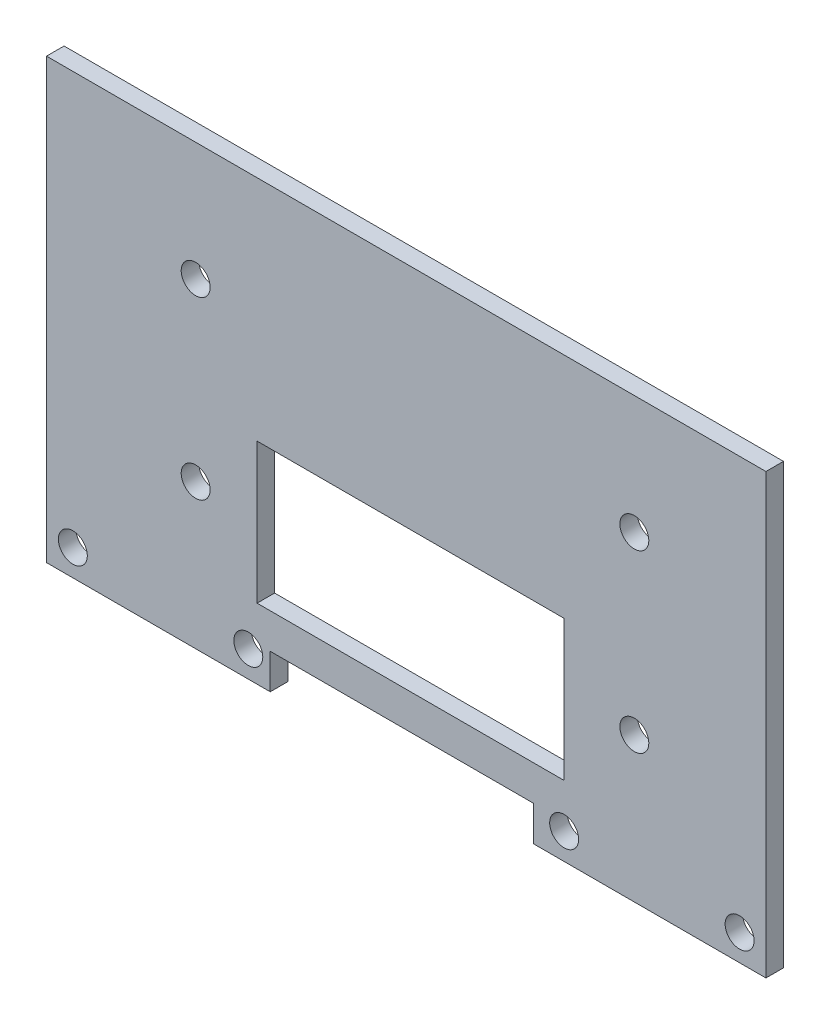
ISO-10303-21;
HEADER;
FILE_DESCRIPTION(('STEP AP214'),'2;1');
FILE_NAME('part.step','',(''),(''),'','','');
FILE_SCHEMA(('AUTOMOTIVE_DESIGN { 1 0 10303 214 1 1 1 1 }'));
ENDSEC;
DATA;
#1=APPLICATION_CONTEXT('core data for automotive mechanical design processes');
#2=APPLICATION_PROTOCOL_DEFINITION('international standard','automotive_design',2000,#1);
#3=PRODUCT_CONTEXT('',#1,'mechanical');
#4=PRODUCT('Part','Part','',(#3));
#5=PRODUCT_RELATED_PRODUCT_CATEGORY('part','',(#4));
#6=PRODUCT_DEFINITION_FORMATION('','',#4);
#7=PRODUCT_DEFINITION_CONTEXT('part definition',#1,'design');
#8=PRODUCT_DEFINITION('design','',#6,#7);
#9=PRODUCT_DEFINITION_SHAPE('','',#8);
#10=(LENGTH_UNIT() NAMED_UNIT(*) SI_UNIT(.MILLI.,.METRE.));
#11=(NAMED_UNIT(*) PLANE_ANGLE_UNIT() SI_UNIT($,.RADIAN.));
#12=(NAMED_UNIT(*) SI_UNIT($,.STERADIAN.) SOLID_ANGLE_UNIT());
#13=UNCERTAINTY_MEASURE_WITH_UNIT(LENGTH_MEASURE(1.E-05),#10,'distance_accuracy_value','');
#14=(GEOMETRIC_REPRESENTATION_CONTEXT(3) GLOBAL_UNCERTAINTY_ASSIGNED_CONTEXT((#13)) GLOBAL_UNIT_ASSIGNED_CONTEXT((#10,
#11,#12)) REPRESENTATION_CONTEXT('',''));
#15=CARTESIAN_POINT('',(0.,0.,0.));
#16=DIRECTION('',(0.,0.,1.));
#17=DIRECTION('',(1.,0.,0.));
#18=AXIS2_PLACEMENT_3D('',#15,#16,#17);
#19=CARTESIAN_POINT('',(-40.,-25.,2.));
#20=DIRECTION('',(0.,1.,0.));
#21=DIRECTION('',(0.,0.,1.));
#22=AXIS2_PLACEMENT_3D('',#19,#20,#21);
#23=PLANE('',#22);
#24=DIRECTION('',(1.,0.,0.));
#25=VECTOR('',#24,1.);
#26=CARTESIAN_POINT('',(-40.,-25.,0.));
#27=LINE('',#26,#25);
#28=CARTESIAN_POINT('',(-42.,-25.,0.));
#29=VERTEX_POINT('',#28);
#30=CARTESIAN_POINT('',(-16.5,-25.,0.));
#31=VERTEX_POINT('',#30);
#32=EDGE_CURVE('E148',#29,#31,#27,.T.);
#33=ORIENTED_EDGE('',*,*,#32,.T.);
#34=DIRECTION('',(0.,0.,1.));
#35=VECTOR('',#34,1.);
#36=CARTESIAN_POINT('',(-16.5,-25.,0.));
#37=LINE('',#36,#35);
#38=CARTESIAN_POINT('',(-16.5,-25.,2.));
#39=VERTEX_POINT('',#38);
#40=EDGE_CURVE('E201',#31,#39,#37,.T.);
#41=ORIENTED_EDGE('',*,*,#40,.T.);
#42=DIRECTION('',(1.,0.,0.));
#43=VECTOR('',#42,1.);
#44=CARTESIAN_POINT('',(-40.,-25.,2.));
#45=LINE('',#44,#43);
#46=CARTESIAN_POINT('',(-42.,-25.,2.));
#47=VERTEX_POINT('',#46);
#48=EDGE_CURVE('E180',#47,#39,#45,.T.);
#49=ORIENTED_EDGE('',*,*,#48,.F.);
#50=DIRECTION('',(0.,0.,1.));
#51=VECTOR('',#50,1.);
#52=CARTESIAN_POINT('',(-42.,-25.,0.));
#53=LINE('',#52,#51);
#54=EDGE_CURVE('E280',#29,#47,#53,.T.);
#55=ORIENTED_EDGE('',*,*,#54,.F.);
#56=EDGE_LOOP('',(#33,#41,#49,#55));
#57=FACE_BOUND('',#56,.T.);
#58=ADVANCED_FACE('F50',(#57),#23,.F.);
#59=CARTESIAN_POINT('',(40.,25.,2.));
#60=DIRECTION('',(-1.,0.,0.));
#61=DIRECTION('',(0.,-1.,0.));
#62=AXIS2_PLACEMENT_3D('',#59,#60,#61);
#63=PLANE('',#62);
#64=DIRECTION('',(0.,1.,0.));
#65=VECTOR('',#64,1.);
#66=CARTESIAN_POINT('',(40.,25.,0.));
#67=LINE('',#66,#65);
#68=CARTESIAN_POINT('',(40.,-25.,0.));
#69=VERTEX_POINT('',#68);
#70=CARTESIAN_POINT('',(40.,25.,0.));
#71=VERTEX_POINT('',#70);
#72=EDGE_CURVE('E144',#69,#71,#67,.T.);
#73=ORIENTED_EDGE('',*,*,#72,.T.);
#74=DIRECTION('',(0.,0.,-1.));
#75=VECTOR('',#74,1.);
#76=CARTESIAN_POINT('',(40.,25.,2.));
#77=LINE('',#76,#75);
#78=CARTESIAN_POINT('',(40.,25.,2.));
#79=VERTEX_POINT('',#78);
#80=EDGE_CURVE('E12',#79,#71,#77,.T.);
#81=ORIENTED_EDGE('',*,*,#80,.F.);
#82=DIRECTION('',(0.,1.,0.));
#83=VECTOR('',#82,1.);
#84=CARTESIAN_POINT('',(40.,25.,2.));
#85=LINE('',#84,#83);
#86=CARTESIAN_POINT('',(40.,-25.,2.));
#87=VERTEX_POINT('',#86);
#88=EDGE_CURVE('E284',#87,#79,#85,.T.);
#89=ORIENTED_EDGE('',*,*,#88,.F.);
#90=DIRECTION('',(0.,0.,-1.));
#91=VECTOR('',#90,1.);
#92=CARTESIAN_POINT('',(40.,-25.,2.));
#93=LINE('',#92,#91);
#94=EDGE_CURVE('E58',#87,#69,#93,.T.);
#95=ORIENTED_EDGE('',*,*,#94,.T.);
#96=EDGE_LOOP('',(#73,#81,#89,#95));
#97=FACE_BOUND('',#96,.T.);
#98=ADVANCED_FACE('F52',(#97),#63,.F.);
#99=CARTESIAN_POINT('',(-40.,25.,2.));
#100=DIRECTION('',(0.,-1.,0.));
#101=DIRECTION('',(0.,0.,-1.));
#102=AXIS2_PLACEMENT_3D('',#99,#100,#101);
#103=PLANE('',#102);
#104=DIRECTION('',(-1.,0.,0.));
#105=VECTOR('',#104,1.);
#106=CARTESIAN_POINT('',(-40.,25.,0.));
#107=LINE('',#106,#105);
#108=CARTESIAN_POINT('',(-42.,25.,0.));
#109=VERTEX_POINT('',#108);
#110=EDGE_CURVE('E149',#71,#109,#107,.T.);
#111=ORIENTED_EDGE('',*,*,#110,.T.);
#112=DIRECTION('',(0.,0.,1.));
#113=VECTOR('',#112,1.);
#114=CARTESIAN_POINT('',(-42.,25.,0.));
#115=LINE('',#114,#113);
#116=CARTESIAN_POINT('',(-42.,25.,2.));
#117=VERTEX_POINT('',#116);
#118=EDGE_CURVE('E276',#109,#117,#115,.T.);
#119=ORIENTED_EDGE('',*,*,#118,.T.);
#120=DIRECTION('',(-1.,0.,0.));
#121=VECTOR('',#120,1.);
#122=CARTESIAN_POINT('',(-40.,25.,2.));
#123=LINE('',#122,#121);
#124=EDGE_CURVE('E185',#79,#117,#123,.T.);
#125=ORIENTED_EDGE('',*,*,#124,.F.);
#126=ORIENTED_EDGE('',*,*,#80,.T.);
#127=EDGE_LOOP('',(#111,#119,#125,#126));
#128=FACE_BOUND('',#127,.T.);
#129=ADVANCED_FACE('F295',(#128),#103,.F.);
#130=CARTESIAN_POINT('',(13.5,-25.,2.));
#131=VERTEX_POINT('',#130);
#132=EDGE_CURVE('E154',#131,#87,#45,.T.);
#133=ORIENTED_EDGE('',*,*,#132,.F.);
#134=DIRECTION('',(0.,0.,1.));
#135=VECTOR('',#134,1.);
#136=CARTESIAN_POINT('',(13.5,-25.,0.));
#137=LINE('',#136,#135);
#138=CARTESIAN_POINT('',(13.5,-25.,0.));
#139=VERTEX_POINT('',#138);
#140=EDGE_CURVE('E152',#139,#131,#137,.T.);
#141=ORIENTED_EDGE('',*,*,#140,.F.);
#142=EDGE_CURVE('E137',#139,#69,#27,.T.);
#143=ORIENTED_EDGE('',*,*,#142,.T.);
#144=ORIENTED_EDGE('',*,*,#94,.F.);
#145=EDGE_LOOP('',(#133,#141,#143,#144));
#146=FACE_BOUND('',#145,.T.);
#147=ADVANCED_FACE('F153',(#146),#23,.F.);
#148=CARTESIAN_POINT('',(0.,0.,2.));
#149=DIRECTION('',(0.,0.,1.));
#150=DIRECTION('',(1.,0.,0.));
#151=AXIS2_PLACEMENT_3D('',#148,#149,#150);
#152=PLANE('',#151);
#153=CARTESIAN_POINT('',(24.9999999999995,11.500000000001,2.));
#154=DIRECTION('',(0.,0.,1.));
#155=DIRECTION('',(1.,0.,0.));
#156=AXIS2_PLACEMENT_3D('',#153,#154,#155);
#157=CIRCLE('',#156,1.65);
#158=CARTESIAN_POINT('',(26.6499999999995,11.500000000001,2.));
#159=VERTEX_POINT('',#158);
#160=EDGE_CURVE('E507',#159,#159,#157,.T.);
#161=ORIENTED_EDGE('',*,*,#160,.F.);
#162=EDGE_LOOP('',(#161));
#163=FACE_BOUND('',#162,.T.);
#164=CARTESIAN_POINT('',(24.9999999999995,-8.49999999999906,2.));
#165=DIRECTION('',(0.,0.,1.));
#166=DIRECTION('',(1.,0.,0.));
#167=AXIS2_PLACEMENT_3D('',#164,#165,#166);
#168=CIRCLE('',#167,1.65);
#169=CARTESIAN_POINT('',(26.6499999999995,-8.49999999999906,2.));
#170=VERTEX_POINT('',#169);
#171=EDGE_CURVE('E511',#170,#170,#168,.T.);
#172=ORIENTED_EDGE('',*,*,#171,.F.);
#173=EDGE_LOOP('',(#172));
#174=FACE_BOUND('',#173,.T.);
#175=CARTESIAN_POINT('',(-25.0000000000005,-8.49999999999906,2.));
#176=DIRECTION('',(0.,0.,1.));
#177=DIRECTION('',(1.,0.,0.));
#178=AXIS2_PLACEMENT_3D('',#175,#176,#177);
#179=CIRCLE('',#178,1.65);
#180=CARTESIAN_POINT('',(-23.3500000000005,-8.49999999999906,2.));
#181=VERTEX_POINT('',#180);
#182=EDGE_CURVE('E525',#181,#181,#179,.T.);
#183=ORIENTED_EDGE('',*,*,#182,.F.);
#184=EDGE_LOOP('',(#183));
#185=FACE_BOUND('',#184,.T.);
#186=CARTESIAN_POINT('',(-25.0000000000005,11.500000000001,2.));
#187=DIRECTION('',(0.,0.,1.));
#188=DIRECTION('',(1.,0.,0.));
#189=AXIS2_PLACEMENT_3D('',#186,#187,#188);
#190=CIRCLE('',#189,1.65);
#191=CARTESIAN_POINT('',(-23.3500000000005,11.500000000001,2.));
#192=VERTEX_POINT('',#191);
#193=EDGE_CURVE('E167',#192,#192,#190,.T.);
#194=ORIENTED_EDGE('',*,*,#193,.F.);
#195=EDGE_LOOP('',(#194));
#196=FACE_BOUND('',#195,.T.);
#197=DIRECTION('',(-1.,0.,0.));
#198=VECTOR('',#197,1.);
#199=CARTESIAN_POINT('',(-15.,-21.,2.));
#200=LINE('',#199,#198);
#201=CARTESIAN_POINT('',(13.5,-21.,2.));
#202=VERTEX_POINT('',#201);
#203=CARTESIAN_POINT('',(-16.5,-21.,2.));
#204=VERTEX_POINT('',#203);
#205=EDGE_CURVE('E238',#202,#204,#200,.T.);
#206=ORIENTED_EDGE('',*,*,#205,.F.);
#207=DIRECTION('',(0.,-1.,0.));
#208=VECTOR('',#207,1.);
#209=CARTESIAN_POINT('',(13.5,-25.,2.));
#210=LINE('',#209,#208);
#211=EDGE_CURVE('E161',#202,#131,#210,.T.);
#212=ORIENTED_EDGE('',*,*,#211,.T.);
#213=ORIENTED_EDGE('',*,*,#132,.T.);
#214=ORIENTED_EDGE('',*,*,#88,.T.);
#215=ORIENTED_EDGE('',*,*,#124,.T.);
#216=DIRECTION('',(0.,-1.,0.));
#217=VECTOR('',#216,1.);
#218=CARTESIAN_POINT('',(-42.,25.,2.));
#219=LINE('',#218,#217);
#220=EDGE_CURVE('E237',#117,#47,#219,.T.);
#221=ORIENTED_EDGE('',*,*,#220,.T.);
#222=ORIENTED_EDGE('',*,*,#48,.T.);
#223=DIRECTION('',(0.,-1.,0.));
#224=VECTOR('',#223,1.);
#225=CARTESIAN_POINT('',(-16.5,-25.,2.));
#226=LINE('',#225,#224);
#227=EDGE_CURVE('E158',#204,#39,#226,.T.);
#228=ORIENTED_EDGE('',*,*,#227,.F.);
#229=EDGE_LOOP('',(#206,#212,#213,#214,#215,#221,#222,#228));
#230=FACE_BOUND('',#229,.T.);
#231=CARTESIAN_POINT('',(-39.,-22.,2.));
#232=DIRECTION('',(0.,0.,1.));
#233=DIRECTION('',(1.,0.,0.));
#234=AXIS2_PLACEMENT_3D('',#231,#232,#233);
#235=CIRCLE('',#234,1.65);
#236=CARTESIAN_POINT('',(-37.35,-22.,2.));
#237=VERTEX_POINT('',#236);
#238=EDGE_CURVE('E211',#237,#237,#235,.T.);
#239=ORIENTED_EDGE('',*,*,#238,.F.);
#240=EDGE_LOOP('',(#239));
#241=FACE_BOUND('',#240,.T.);
#242=CARTESIAN_POINT('',(-19.,-22.,2.));
#243=DIRECTION('',(0.,0.,1.));
#244=DIRECTION('',(1.,0.,0.));
#245=AXIS2_PLACEMENT_3D('',#242,#243,#244);
#246=CIRCLE('',#245,1.65);
#247=CARTESIAN_POINT('',(-17.35,-22.,2.));
#248=VERTEX_POINT('',#247);
#249=EDGE_CURVE('E215',#248,#248,#246,.T.);
#250=ORIENTED_EDGE('',*,*,#249,.F.);
#251=EDGE_LOOP('',(#250));
#252=FACE_BOUND('',#251,.T.);
#253=CARTESIAN_POINT('',(17.,-22.,2.));
#254=DIRECTION('',(0.,0.,1.));
#255=DIRECTION('',(-1.,0.,0.));
#256=AXIS2_PLACEMENT_3D('',#253,#254,#255);
#257=CIRCLE('',#256,1.65);
#258=CARTESIAN_POINT('',(15.35,-22.,2.));
#259=VERTEX_POINT('',#258);
#260=EDGE_CURVE('E225',#259,#259,#257,.T.);
#261=ORIENTED_EDGE('',*,*,#260,.F.);
#262=EDGE_LOOP('',(#261));
#263=FACE_BOUND('',#262,.T.);
#264=CARTESIAN_POINT('',(37.,-22.,2.));
#265=DIRECTION('',(0.,0.,1.));
#266=DIRECTION('',(-1.,0.,0.));
#267=AXIS2_PLACEMENT_3D('',#264,#265,#266);
#268=CIRCLE('',#267,1.65);
#269=CARTESIAN_POINT('',(35.35,-22.,2.));
#270=VERTEX_POINT('',#269);
#271=EDGE_CURVE('E231',#270,#270,#268,.T.);
#272=ORIENTED_EDGE('',*,*,#271,.F.);
#273=EDGE_LOOP('',(#272));
#274=FACE_BOUND('',#273,.T.);
#275=DIRECTION('',(0.,-1.,0.));
#276=VECTOR('',#275,1.);
#277=CARTESIAN_POINT('',(-18.,-0.999999999999997,2.));
#278=LINE('',#277,#276);
#279=CARTESIAN_POINT('',(-18.,-0.999999999999997,2.));
#280=VERTEX_POINT('',#279);
#281=CARTESIAN_POINT('',(-18.,-17.,2.));
#282=VERTEX_POINT('',#281);
#283=EDGE_CURVE('E241',#280,#282,#278,.T.);
#284=ORIENTED_EDGE('',*,*,#283,.F.);
#285=DIRECTION('',(-1.,0.,0.));
#286=VECTOR('',#285,1.);
#287=CARTESIAN_POINT('',(-18.,-0.999999999999997,2.));
#288=LINE('',#287,#286);
#289=CARTESIAN_POINT('',(17.,-0.999999999999997,2.));
#290=VERTEX_POINT('',#289);
#291=EDGE_CURVE('E251',#290,#280,#288,.T.);
#292=ORIENTED_EDGE('',*,*,#291,.F.);
#293=DIRECTION('',(0.,1.,0.));
#294=VECTOR('',#293,1.);
#295=CARTESIAN_POINT('',(17.,-0.999999999999997,2.));
#296=LINE('',#295,#294);
#297=CARTESIAN_POINT('',(17.,-17.,2.));
#298=VERTEX_POINT('',#297);
#299=EDGE_CURVE('E255',#298,#290,#296,.T.);
#300=ORIENTED_EDGE('',*,*,#299,.F.);
#301=DIRECTION('',(1.,0.,0.));
#302=VECTOR('',#301,1.);
#303=CARTESIAN_POINT('',(-18.,-17.,2.));
#304=LINE('',#303,#302);
#305=EDGE_CURVE('E262',#282,#298,#304,.T.);
#306=ORIENTED_EDGE('',*,*,#305,.F.);
#307=EDGE_LOOP('',(#284,#292,#300,#306));
#308=FACE_BOUND('',#307,.T.);
#309=ADVANCED_FACE('F298',(#163,#174,#185,#196,#230,#241,#252,#263,#274,#308),#152,.T.);
#310=CARTESIAN_POINT('',(0.,0.,0.));
#311=DIRECTION('',(0.,0.,1.));
#312=DIRECTION('',(1.,0.,0.));
#313=AXIS2_PLACEMENT_3D('',#310,#311,#312);
#314=PLANE('',#313);
#315=CARTESIAN_POINT('',(24.9999999999995,11.500000000001,0.));
#316=DIRECTION('',(0.,0.,1.));
#317=DIRECTION('',(1.,0.,0.));
#318=AXIS2_PLACEMENT_3D('',#315,#316,#317);
#319=CIRCLE('',#318,1.65);
#320=CARTESIAN_POINT('',(26.6499999999995,11.500000000001,0.));
#321=VERTEX_POINT('',#320);
#322=EDGE_CURVE('E504',#321,#321,#319,.T.);
#323=ORIENTED_EDGE('',*,*,#322,.T.);
#324=EDGE_LOOP('',(#323));
#325=FACE_BOUND('',#324,.T.);
#326=CARTESIAN_POINT('',(24.9999999999995,-8.49999999999906,0.));
#327=DIRECTION('',(0.,0.,1.));
#328=DIRECTION('',(1.,0.,0.));
#329=AXIS2_PLACEMENT_3D('',#326,#327,#328);
#330=CIRCLE('',#329,1.65);
#331=CARTESIAN_POINT('',(26.6499999999995,-8.49999999999906,0.));
#332=VERTEX_POINT('',#331);
#333=EDGE_CURVE('E508',#332,#332,#330,.T.);
#334=ORIENTED_EDGE('',*,*,#333,.T.);
#335=EDGE_LOOP('',(#334));
#336=FACE_BOUND('',#335,.T.);
#337=CARTESIAN_POINT('',(-25.0000000000005,-8.49999999999906,0.));
#338=DIRECTION('',(0.,0.,1.));
#339=DIRECTION('',(1.,0.,0.));
#340=AXIS2_PLACEMENT_3D('',#337,#338,#339);
#341=CIRCLE('',#340,1.65);
#342=CARTESIAN_POINT('',(-23.3500000000005,-8.49999999999906,0.));
#343=VERTEX_POINT('',#342);
#344=EDGE_CURVE('E523',#343,#343,#341,.T.);
#345=ORIENTED_EDGE('',*,*,#344,.T.);
#346=EDGE_LOOP('',(#345));
#347=FACE_BOUND('',#346,.T.);
#348=CARTESIAN_POINT('',(-25.0000000000005,11.500000000001,0.));
#349=DIRECTION('',(0.,0.,1.));
#350=DIRECTION('',(1.,0.,0.));
#351=AXIS2_PLACEMENT_3D('',#348,#349,#350);
#352=CIRCLE('',#351,1.65);
#353=CARTESIAN_POINT('',(-23.3500000000005,11.500000000001,0.));
#354=VERTEX_POINT('',#353);
#355=EDGE_CURVE('E164',#354,#354,#352,.T.);
#356=ORIENTED_EDGE('',*,*,#355,.T.);
#357=EDGE_LOOP('',(#356));
#358=FACE_BOUND('',#357,.T.);
#359=DIRECTION('',(0.,-1.,0.));
#360=VECTOR('',#359,1.);
#361=CARTESIAN_POINT('',(13.5,-25.,0.));
#362=LINE('',#361,#360);
#363=CARTESIAN_POINT('',(13.5,-21.,0.));
#364=VERTEX_POINT('',#363);
#365=EDGE_CURVE('E142',#364,#139,#362,.T.);
#366=ORIENTED_EDGE('',*,*,#365,.F.);
#367=DIRECTION('',(-1.,0.,0.));
#368=VECTOR('',#367,1.);
#369=CARTESIAN_POINT('',(-15.,-21.,0.));
#370=LINE('',#369,#368);
#371=CARTESIAN_POINT('',(-16.5,-21.,0.));
#372=VERTEX_POINT('',#371);
#373=EDGE_CURVE('E65',#364,#372,#370,.T.);
#374=ORIENTED_EDGE('',*,*,#373,.T.);
#375=DIRECTION('',(0.,-1.,0.));
#376=VECTOR('',#375,1.);
#377=CARTESIAN_POINT('',(-16.5,-25.,0.));
#378=LINE('',#377,#376);
#379=EDGE_CURVE('E200',#372,#31,#378,.T.);
#380=ORIENTED_EDGE('',*,*,#379,.T.);
#381=ORIENTED_EDGE('',*,*,#32,.F.);
#382=DIRECTION('',(0.,-1.,0.));
#383=VECTOR('',#382,1.);
#384=CARTESIAN_POINT('',(-42.,25.,0.));
#385=LINE('',#384,#383);
#386=EDGE_CURVE('E274',#109,#29,#385,.T.);
#387=ORIENTED_EDGE('',*,*,#386,.F.);
#388=ORIENTED_EDGE('',*,*,#110,.F.);
#389=ORIENTED_EDGE('',*,*,#72,.F.);
#390=ORIENTED_EDGE('',*,*,#142,.F.);
#391=EDGE_LOOP('',(#366,#374,#380,#381,#387,#388,#389,#390));
#392=FACE_BOUND('',#391,.T.);
#393=CARTESIAN_POINT('',(-39.,-22.,0.));
#394=DIRECTION('',(0.,0.,1.));
#395=DIRECTION('',(1.,0.,0.));
#396=AXIS2_PLACEMENT_3D('',#393,#394,#395);
#397=CIRCLE('',#396,1.65);
#398=CARTESIAN_POINT('',(-37.35,-22.,0.));
#399=VERTEX_POINT('',#398);
#400=EDGE_CURVE('E208',#399,#399,#397,.T.);
#401=ORIENTED_EDGE('',*,*,#400,.T.);
#402=EDGE_LOOP('',(#401));
#403=FACE_BOUND('',#402,.T.);
#404=CARTESIAN_POINT('',(-19.,-22.,0.));
#405=DIRECTION('',(0.,0.,1.));
#406=DIRECTION('',(1.,0.,0.));
#407=AXIS2_PLACEMENT_3D('',#404,#405,#406);
#408=CIRCLE('',#407,1.65);
#409=CARTESIAN_POINT('',(-17.35,-22.,0.));
#410=VERTEX_POINT('',#409);
#411=EDGE_CURVE('E219',#410,#410,#408,.T.);
#412=ORIENTED_EDGE('',*,*,#411,.T.);
#413=EDGE_LOOP('',(#412));
#414=FACE_BOUND('',#413,.T.);
#415=CARTESIAN_POINT('',(17.,-22.,0.));
#416=DIRECTION('',(0.,0.,1.));
#417=DIRECTION('',(-1.,0.,0.));
#418=AXIS2_PLACEMENT_3D('',#415,#416,#417);
#419=CIRCLE('',#418,1.65);
#420=CARTESIAN_POINT('',(15.35,-22.,0.));
#421=VERTEX_POINT('',#420);
#422=EDGE_CURVE('E229',#421,#421,#419,.T.);
#423=ORIENTED_EDGE('',*,*,#422,.T.);
#424=EDGE_LOOP('',(#423));
#425=FACE_BOUND('',#424,.T.);
#426=CARTESIAN_POINT('',(37.,-22.,0.));
#427=DIRECTION('',(0.,0.,1.));
#428=DIRECTION('',(-1.,0.,0.));
#429=AXIS2_PLACEMENT_3D('',#426,#427,#428);
#430=CIRCLE('',#429,1.65);
#431=CARTESIAN_POINT('',(35.35,-22.,0.));
#432=VERTEX_POINT('',#431);
#433=EDGE_CURVE('E204',#432,#432,#430,.T.);
#434=ORIENTED_EDGE('',*,*,#433,.T.);
#435=EDGE_LOOP('',(#434));
#436=FACE_BOUND('',#435,.T.);
#437=DIRECTION('',(-1.,0.,0.));
#438=VECTOR('',#437,1.);
#439=CARTESIAN_POINT('',(-18.,-0.999999999999997,0.));
#440=LINE('',#439,#438);
#441=CARTESIAN_POINT('',(17.,-0.999999999999997,0.));
#442=VERTEX_POINT('',#441);
#443=CARTESIAN_POINT('',(-18.,-0.999999999999997,0.));
#444=VERTEX_POINT('',#443);
#445=EDGE_CURVE('E245',#442,#444,#440,.T.);
#446=ORIENTED_EDGE('',*,*,#445,.T.);
#447=DIRECTION('',(0.,-1.,0.));
#448=VECTOR('',#447,1.);
#449=CARTESIAN_POINT('',(-18.,-0.999999999999997,0.));
#450=LINE('',#449,#448);
#451=CARTESIAN_POINT('',(-18.,-17.,0.));
#452=VERTEX_POINT('',#451);
#453=EDGE_CURVE('E256',#444,#452,#450,.T.);
#454=ORIENTED_EDGE('',*,*,#453,.T.);
#455=DIRECTION('',(1.,0.,0.));
#456=VECTOR('',#455,1.);
#457=CARTESIAN_POINT('',(-18.,-17.,0.));
#458=LINE('',#457,#456);
#459=CARTESIAN_POINT('',(17.,-17.,0.));
#460=VERTEX_POINT('',#459);
#461=EDGE_CURVE('E269',#452,#460,#458,.T.);
#462=ORIENTED_EDGE('',*,*,#461,.T.);
#463=DIRECTION('',(0.,1.,0.));
#464=VECTOR('',#463,1.);
#465=CARTESIAN_POINT('',(17.,-0.999999999999997,0.));
#466=LINE('',#465,#464);
#467=EDGE_CURVE('E266',#460,#442,#466,.T.);
#468=ORIENTED_EDGE('',*,*,#467,.T.);
#469=EDGE_LOOP('',(#446,#454,#462,#468));
#470=FACE_BOUND('',#469,.T.);
#471=ADVANCED_FACE('F139',(#325,#336,#347,#358,#392,#403,#414,#425,#436,#470),#314,.F.);
#472=CARTESIAN_POINT('',(-42.,25.,0.));
#473=DIRECTION('',(-1.,0.,0.));
#474=DIRECTION('',(0.,0.,1.));
#475=AXIS2_PLACEMENT_3D('',#472,#473,#474);
#476=PLANE('',#475);
#477=ORIENTED_EDGE('',*,*,#220,.F.);
#478=ORIENTED_EDGE('',*,*,#118,.F.);
#479=ORIENTED_EDGE('',*,*,#386,.T.);
#480=ORIENTED_EDGE('',*,*,#54,.T.);
#481=EDGE_LOOP('',(#477,#478,#479,#480));
#482=FACE_BOUND('',#481,.T.);
#483=ADVANCED_FACE('F302',(#482),#476,.T.);
#484=CARTESIAN_POINT('',(-18.,-0.999999999999997,0.));
#485=DIRECTION('',(-1.,0.,0.));
#486=DIRECTION('',(0.,-1.,0.));
#487=AXIS2_PLACEMENT_3D('',#484,#485,#486);
#488=PLANE('',#487);
#489=ORIENTED_EDGE('',*,*,#283,.T.);
#490=DIRECTION('',(0.,0.,1.));
#491=VECTOR('',#490,1.);
#492=CARTESIAN_POINT('',(-18.,-17.,0.));
#493=LINE('',#492,#491);
#494=EDGE_CURVE('E242',#452,#282,#493,.T.);
#495=ORIENTED_EDGE('',*,*,#494,.F.);
#496=ORIENTED_EDGE('',*,*,#453,.F.);
#497=DIRECTION('',(0.,0.,1.));
#498=VECTOR('',#497,1.);
#499=CARTESIAN_POINT('',(-18.,-0.999999999999997,0.));
#500=LINE('',#499,#498);
#501=EDGE_CURVE('E210',#444,#280,#500,.T.);
#502=ORIENTED_EDGE('',*,*,#501,.T.);
#503=EDGE_LOOP('',(#489,#495,#496,#502));
#504=FACE_BOUND('',#503,.T.);
#505=ADVANCED_FACE('F353',(#504),#488,.F.);
#506=CARTESIAN_POINT('',(-18.,-0.999999999999997,0.));
#507=DIRECTION('',(0.,1.,0.));
#508=DIRECTION('',(0.,0.,1.));
#509=AXIS2_PLACEMENT_3D('',#506,#507,#508);
#510=PLANE('',#509);
#511=ORIENTED_EDGE('',*,*,#291,.T.);
#512=ORIENTED_EDGE('',*,*,#501,.F.);
#513=ORIENTED_EDGE('',*,*,#445,.F.);
#514=DIRECTION('',(0.,0.,1.));
#515=VECTOR('',#514,1.);
#516=CARTESIAN_POINT('',(17.,-0.999999999999997,0.));
#517=LINE('',#516,#515);
#518=EDGE_CURVE('E248',#442,#290,#517,.T.);
#519=ORIENTED_EDGE('',*,*,#518,.T.);
#520=EDGE_LOOP('',(#511,#512,#513,#519));
#521=FACE_BOUND('',#520,.T.);
#522=ADVANCED_FACE('F363',(#521),#510,.F.);
#523=CARTESIAN_POINT('',(17.,-0.999999999999997,0.));
#524=DIRECTION('',(1.,0.,0.));
#525=DIRECTION('',(0.,1.,0.));
#526=AXIS2_PLACEMENT_3D('',#523,#524,#525);
#527=PLANE('',#526);
#528=ORIENTED_EDGE('',*,*,#299,.T.);
#529=ORIENTED_EDGE('',*,*,#518,.F.);
#530=ORIENTED_EDGE('',*,*,#467,.F.);
#531=DIRECTION('',(0.,0.,1.));
#532=VECTOR('',#531,1.);
#533=CARTESIAN_POINT('',(17.,-17.,0.));
#534=LINE('',#533,#532);
#535=EDGE_CURVE('E246',#460,#298,#534,.T.);
#536=ORIENTED_EDGE('',*,*,#535,.T.);
#537=EDGE_LOOP('',(#528,#529,#530,#536));
#538=FACE_BOUND('',#537,.T.);
#539=ADVANCED_FACE('F322',(#538),#527,.F.);
#540=CARTESIAN_POINT('',(-18.,-17.,0.));
#541=DIRECTION('',(0.,-1.,0.));
#542=DIRECTION('',(0.,0.,-1.));
#543=AXIS2_PLACEMENT_3D('',#540,#541,#542);
#544=PLANE('',#543);
#545=ORIENTED_EDGE('',*,*,#305,.T.);
#546=ORIENTED_EDGE('',*,*,#535,.F.);
#547=ORIENTED_EDGE('',*,*,#461,.F.);
#548=ORIENTED_EDGE('',*,*,#494,.T.);
#549=EDGE_LOOP('',(#545,#546,#547,#548));
#550=FACE_BOUND('',#549,.T.);
#551=ADVANCED_FACE('F311',(#550),#544,.F.);
#552=CARTESIAN_POINT('',(-15.,-21.,0.));
#553=DIRECTION('',(0.,1.,0.));
#554=DIRECTION('',(-1.,0.,0.));
#555=AXIS2_PLACEMENT_3D('',#552,#553,#554);
#556=PLANE('',#555);
#557=ORIENTED_EDGE('',*,*,#373,.F.);
#558=DIRECTION('',(0.,0.,1.));
#559=VECTOR('',#558,1.);
#560=CARTESIAN_POINT('',(13.5,-21.,0.));
#561=LINE('',#560,#559);
#562=EDGE_CURVE('E69',#364,#202,#561,.T.);
#563=ORIENTED_EDGE('',*,*,#562,.T.);
#564=ORIENTED_EDGE('',*,*,#205,.T.);
#565=DIRECTION('',(0.,0.,1.));
#566=VECTOR('',#565,1.);
#567=CARTESIAN_POINT('',(-16.5,-21.,0.));
#568=LINE('',#567,#566);
#569=EDGE_CURVE('E205',#372,#204,#568,.T.);
#570=ORIENTED_EDGE('',*,*,#569,.F.);
#571=EDGE_LOOP('',(#557,#563,#564,#570));
#572=FACE_BOUND('',#571,.T.);
#573=ADVANCED_FACE('F308',(#572),#556,.F.);
#574=CARTESIAN_POINT('',(37.,-22.,0.));
#575=DIRECTION('',(0.,0.,1.));
#576=DIRECTION('',(1.,0.,0.));
#577=AXIS2_PLACEMENT_3D('',#574,#575,#576);
#578=CYLINDRICAL_SURFACE('',#577,1.65);
#579=ORIENTED_EDGE('',*,*,#433,.F.);
#580=EDGE_LOOP('',(#579));
#581=FACE_BOUND('',#580,.T.);
#582=ORIENTED_EDGE('',*,*,#271,.T.);
#583=EDGE_LOOP('',(#582));
#584=FACE_BOUND('',#583,.T.);
#585=ADVANCED_FACE('F310',(#581,#584),#578,.F.);
#586=CARTESIAN_POINT('',(17.,-22.,0.));
#587=DIRECTION('',(0.,0.,1.));
#588=DIRECTION('',(1.,0.,0.));
#589=AXIS2_PLACEMENT_3D('',#586,#587,#588);
#590=CYLINDRICAL_SURFACE('',#589,1.65);
#591=ORIENTED_EDGE('',*,*,#422,.F.);
#592=EDGE_LOOP('',(#591));
#593=FACE_BOUND('',#592,.T.);
#594=ORIENTED_EDGE('',*,*,#260,.T.);
#595=EDGE_LOOP('',(#594));
#596=FACE_BOUND('',#595,.T.);
#597=ADVANCED_FACE('F318',(#593,#596),#590,.F.);
#598=CARTESIAN_POINT('',(-19.,-22.,0.));
#599=DIRECTION('',(0.,0.,1.));
#600=DIRECTION('',(1.,0.,0.));
#601=AXIS2_PLACEMENT_3D('',#598,#599,#600);
#602=CYLINDRICAL_SURFACE('',#601,1.65);
#603=ORIENTED_EDGE('',*,*,#411,.F.);
#604=EDGE_LOOP('',(#603));
#605=FACE_BOUND('',#604,.T.);
#606=ORIENTED_EDGE('',*,*,#249,.T.);
#607=EDGE_LOOP('',(#606));
#608=FACE_BOUND('',#607,.T.);
#609=ADVANCED_FACE('F399',(#605,#608),#602,.F.);
#610=CARTESIAN_POINT('',(-39.,-22.,0.));
#611=DIRECTION('',(0.,0.,1.));
#612=DIRECTION('',(1.,0.,0.));
#613=AXIS2_PLACEMENT_3D('',#610,#611,#612);
#614=CYLINDRICAL_SURFACE('',#613,1.65);
#615=ORIENTED_EDGE('',*,*,#400,.F.);
#616=EDGE_LOOP('',(#615));
#617=FACE_BOUND('',#616,.T.);
#618=ORIENTED_EDGE('',*,*,#238,.T.);
#619=EDGE_LOOP('',(#618));
#620=FACE_BOUND('',#619,.T.);
#621=ADVANCED_FACE('F407',(#617,#620),#614,.F.);
#622=CARTESIAN_POINT('',(-16.5,-25.,0.));
#623=DIRECTION('',(-1.,0.,0.));
#624=DIRECTION('',(0.,0.,1.));
#625=AXIS2_PLACEMENT_3D('',#622,#623,#624);
#626=PLANE('',#625);
#627=ORIENTED_EDGE('',*,*,#227,.T.);
#628=ORIENTED_EDGE('',*,*,#40,.F.);
#629=ORIENTED_EDGE('',*,*,#379,.F.);
#630=ORIENTED_EDGE('',*,*,#569,.T.);
#631=EDGE_LOOP('',(#627,#628,#629,#630));
#632=FACE_BOUND('',#631,.T.);
#633=ADVANCED_FACE('F307',(#632),#626,.F.);
#634=CARTESIAN_POINT('',(13.5,-25.,0.));
#635=DIRECTION('',(-1.,0.,0.));
#636=DIRECTION('',(0.,0.,1.));
#637=AXIS2_PLACEMENT_3D('',#634,#635,#636);
#638=PLANE('',#637);
#639=ORIENTED_EDGE('',*,*,#211,.F.);
#640=ORIENTED_EDGE('',*,*,#562,.F.);
#641=ORIENTED_EDGE('',*,*,#365,.T.);
#642=ORIENTED_EDGE('',*,*,#140,.T.);
#643=EDGE_LOOP('',(#639,#640,#641,#642));
#644=FACE_BOUND('',#643,.T.);
#645=ADVANCED_FACE('F160',(#644),#638,.T.);
#646=CARTESIAN_POINT('',(-25.0000000000005,11.500000000001,0.));
#647=DIRECTION('',(0.,0.,1.));
#648=DIRECTION('',(1.,0.,0.));
#649=AXIS2_PLACEMENT_3D('',#646,#647,#648);
#650=CYLINDRICAL_SURFACE('',#649,1.65);
#651=ORIENTED_EDGE('',*,*,#355,.F.);
#652=EDGE_LOOP('',(#651));
#653=FACE_BOUND('',#652,.T.);
#654=ORIENTED_EDGE('',*,*,#193,.T.);
#655=EDGE_LOOP('',(#654));
#656=FACE_BOUND('',#655,.T.);
#657=ADVANCED_FACE('F460',(#653,#656),#650,.F.);
#658=CARTESIAN_POINT('',(-25.0000000000005,-8.49999999999906,0.));
#659=DIRECTION('',(0.,0.,1.));
#660=DIRECTION('',(1.,0.,0.));
#661=AXIS2_PLACEMENT_3D('',#658,#659,#660);
#662=CYLINDRICAL_SURFACE('',#661,1.65);
#663=ORIENTED_EDGE('',*,*,#344,.F.);
#664=EDGE_LOOP('',(#663));
#665=FACE_BOUND('',#664,.T.);
#666=ORIENTED_EDGE('',*,*,#182,.T.);
#667=EDGE_LOOP('',(#666));
#668=FACE_BOUND('',#667,.T.);
#669=ADVANCED_FACE('F468',(#665,#668),#662,.F.);
#670=CARTESIAN_POINT('',(24.9999999999995,-8.49999999999906,0.));
#671=DIRECTION('',(0.,0.,1.));
#672=DIRECTION('',(1.,0.,0.));
#673=AXIS2_PLACEMENT_3D('',#670,#671,#672);
#674=CYLINDRICAL_SURFACE('',#673,1.65);
#675=ORIENTED_EDGE('',*,*,#333,.F.);
#676=EDGE_LOOP('',(#675));
#677=FACE_BOUND('',#676,.T.);
#678=ORIENTED_EDGE('',*,*,#171,.T.);
#679=EDGE_LOOP('',(#678));
#680=FACE_BOUND('',#679,.T.);
#681=ADVANCED_FACE('F478',(#677,#680),#674,.F.);
#682=CARTESIAN_POINT('',(24.9999999999995,11.500000000001,0.));
#683=DIRECTION('',(0.,0.,1.));
#684=DIRECTION('',(1.,0.,0.));
#685=AXIS2_PLACEMENT_3D('',#682,#683,#684);
#686=CYLINDRICAL_SURFACE('',#685,1.65);
#687=ORIENTED_EDGE('',*,*,#322,.F.);
#688=EDGE_LOOP('',(#687));
#689=FACE_BOUND('',#688,.T.);
#690=ORIENTED_EDGE('',*,*,#160,.T.);
#691=EDGE_LOOP('',(#690));
#692=FACE_BOUND('',#691,.T.);
#693=ADVANCED_FACE('F488',(#689,#692),#686,.F.);
#694=CLOSED_SHELL('',(#58,#98,#129,#147,#309,#471,#483,#505,#522,#539,#551,#573,#585,#597,#609,
#621,#633,#645,#657,#669,#681,#693));
#695=MANIFOLD_SOLID_BREP('B2',#694);
#696=ADVANCED_BREP_SHAPE_REPRESENTATION('',(#18,#695),#14);
#697=SHAPE_DEFINITION_REPRESENTATION(#9,#696);
ENDSEC;
END-ISO-10303-21;
